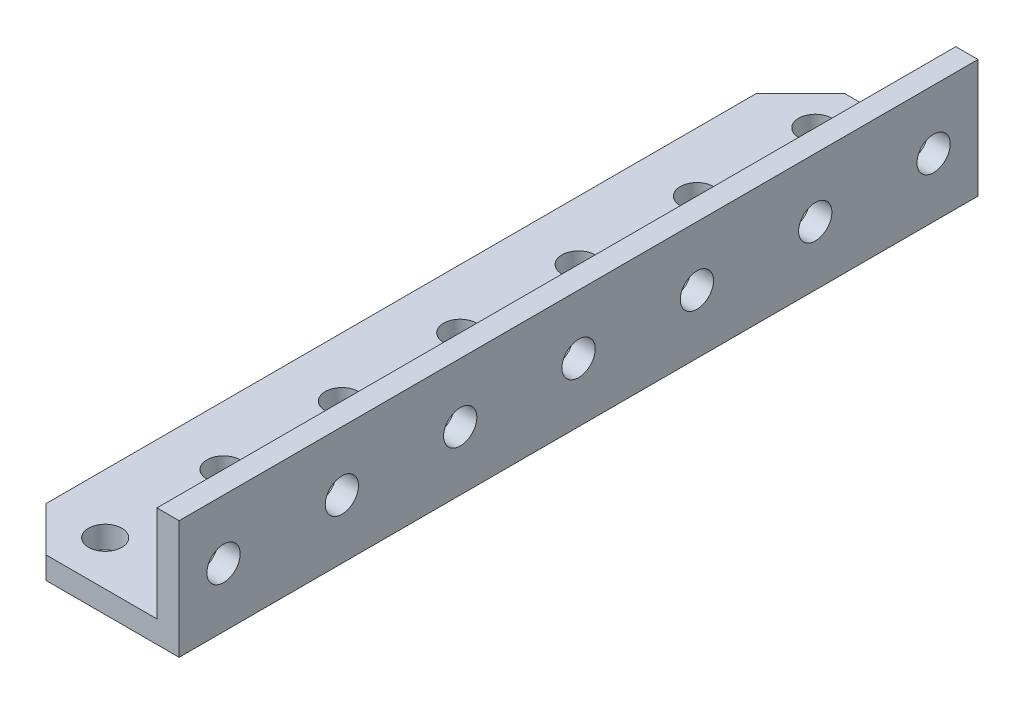
ISO-10303-21;
HEADER;
FILE_DESCRIPTION(('STEP AP214'),'2;1');
FILE_NAME('part.step','',(''),(''),'','','');
FILE_SCHEMA(('AUTOMOTIVE_DESIGN { 1 0 10303 214 1 1 1 1 }'));
ENDSEC;
DATA;
#1=APPLICATION_CONTEXT('core data for automotive mechanical design processes');
#2=APPLICATION_PROTOCOL_DEFINITION('international standard','automotive_design',2000,#1);
#3=PRODUCT_CONTEXT('',#1,'mechanical');
#4=PRODUCT('Part','Part','',(#3));
#5=PRODUCT_RELATED_PRODUCT_CATEGORY('part','',(#4));
#6=PRODUCT_DEFINITION_FORMATION('','',#4);
#7=PRODUCT_DEFINITION_CONTEXT('part definition',#1,'design');
#8=PRODUCT_DEFINITION('design','',#6,#7);
#9=PRODUCT_DEFINITION_SHAPE('','',#8);
#10=(LENGTH_UNIT() NAMED_UNIT(*) SI_UNIT(.MILLI.,.METRE.));
#11=(NAMED_UNIT(*) PLANE_ANGLE_UNIT() SI_UNIT($,.RADIAN.));
#12=(NAMED_UNIT(*) SI_UNIT($,.STERADIAN.) SOLID_ANGLE_UNIT());
#13=UNCERTAINTY_MEASURE_WITH_UNIT(LENGTH_MEASURE(1.E-05),#10,'distance_accuracy_value','');
#14=(GEOMETRIC_REPRESENTATION_CONTEXT(3) GLOBAL_UNCERTAINTY_ASSIGNED_CONTEXT((#13)) GLOBAL_UNIT_ASSIGNED_CONTEXT((#10,
#11,#12)) REPRESENTATION_CONTEXT('',''));
#15=CARTESIAN_POINT('',(0.,0.,0.));
#16=DIRECTION('',(0.,0.,1.));
#17=DIRECTION('',(1.,0.,0.));
#18=AXIS2_PLACEMENT_3D('',#15,#16,#17);
#19=CARTESIAN_POINT('',(33.3375,25.4,177.8));
#20=DIRECTION('',(1.,0.,0.));
#21=DIRECTION('',(0.,0.,-1.));
#22=AXIS2_PLACEMENT_3D('',#19,#20,#21);
#23=PLANE('',#22);
#24=CARTESIAN_POINT('',(33.3375,12.7,165.1));
#25=DIRECTION('',(-1.,0.,0.));
#26=DIRECTION('',(0.,0.,1.));
#27=AXIS2_PLACEMENT_3D('',#24,#25,#26);
#28=CIRCLE('',#27,3.57124);
#29=CARTESIAN_POINT('',(33.3375,12.7,168.67124));
#30=VERTEX_POINT('',#29);
#31=EDGE_CURVE('E236',#30,#30,#28,.T.);
#32=ORIENTED_EDGE('',*,*,#31,.F.);
#33=EDGE_LOOP('',(#32));
#34=FACE_BOUND('',#33,.T.);
#35=CARTESIAN_POINT('',(33.3375,12.7,139.7));
#36=DIRECTION('',(-1.,0.,0.));
#37=DIRECTION('',(0.,0.,1.));
#38=AXIS2_PLACEMENT_3D('',#35,#36,#37);
#39=CIRCLE('',#38,3.57124);
#40=CARTESIAN_POINT('',(33.3375,12.7,143.27124));
#41=VERTEX_POINT('',#40);
#42=EDGE_CURVE('E230',#41,#41,#39,.T.);
#43=ORIENTED_EDGE('',*,*,#42,.F.);
#44=EDGE_LOOP('',(#43));
#45=FACE_BOUND('',#44,.T.);
#46=CARTESIAN_POINT('',(33.3375,12.7,114.3));
#47=DIRECTION('',(-1.,0.,0.));
#48=DIRECTION('',(0.,0.,1.));
#49=AXIS2_PLACEMENT_3D('',#46,#47,#48);
#50=CIRCLE('',#49,3.57124);
#51=CARTESIAN_POINT('',(33.3375,12.7,117.87124));
#52=VERTEX_POINT('',#51);
#53=EDGE_CURVE('E224',#52,#52,#50,.T.);
#54=ORIENTED_EDGE('',*,*,#53,.F.);
#55=EDGE_LOOP('',(#54));
#56=FACE_BOUND('',#55,.T.);
#57=CARTESIAN_POINT('',(33.3375,12.7,88.9));
#58=DIRECTION('',(-1.,0.,0.));
#59=DIRECTION('',(0.,0.,1.));
#60=AXIS2_PLACEMENT_3D('',#57,#58,#59);
#61=CIRCLE('',#60,3.57124);
#62=CARTESIAN_POINT('',(33.3375,12.7,92.47124));
#63=VERTEX_POINT('',#62);
#64=EDGE_CURVE('E218',#63,#63,#61,.T.);
#65=ORIENTED_EDGE('',*,*,#64,.F.);
#66=EDGE_LOOP('',(#65));
#67=FACE_BOUND('',#66,.T.);
#68=CARTESIAN_POINT('',(33.3375,12.7,63.5));
#69=DIRECTION('',(-1.,0.,0.));
#70=DIRECTION('',(0.,0.,1.));
#71=AXIS2_PLACEMENT_3D('',#68,#69,#70);
#72=CIRCLE('',#71,3.57124);
#73=CARTESIAN_POINT('',(33.3375,12.7,67.07124));
#74=VERTEX_POINT('',#73);
#75=EDGE_CURVE('E212',#74,#74,#72,.T.);
#76=ORIENTED_EDGE('',*,*,#75,.F.);
#77=EDGE_LOOP('',(#76));
#78=FACE_BOUND('',#77,.T.);
#79=CARTESIAN_POINT('',(33.3375,12.7,38.1));
#80=DIRECTION('',(-1.,0.,0.));
#81=DIRECTION('',(0.,0.,1.));
#82=AXIS2_PLACEMENT_3D('',#79,#80,#81);
#83=CIRCLE('',#82,3.57124);
#84=CARTESIAN_POINT('',(33.3375,12.7,41.67124));
#85=VERTEX_POINT('',#84);
#86=EDGE_CURVE('E206',#85,#85,#83,.T.);
#87=ORIENTED_EDGE('',*,*,#86,.F.);
#88=EDGE_LOOP('',(#87));
#89=FACE_BOUND('',#88,.T.);
#90=CARTESIAN_POINT('',(33.3375,12.7,12.7));
#91=DIRECTION('',(-1.,0.,0.));
#92=DIRECTION('',(0.,0.,1.));
#93=AXIS2_PLACEMENT_3D('',#90,#91,#92);
#94=CIRCLE('',#93,3.57124);
#95=CARTESIAN_POINT('',(33.3375,12.7,16.27124));
#96=VERTEX_POINT('',#95);
#97=EDGE_CURVE('E196',#96,#96,#94,.T.);
#98=ORIENTED_EDGE('',*,*,#97,.F.);
#99=EDGE_LOOP('',(#98));
#100=FACE_BOUND('',#99,.T.);
#101=DIRECTION('',(0.,-1.,0.));
#102=VECTOR('',#101,1.);
#103=CARTESIAN_POINT('',(33.3375,25.4,174.625));
#104=LINE('',#103,#102);
#105=CARTESIAN_POINT('',(33.3375,25.4,174.625));
#106=VERTEX_POINT('',#105);
#107=CARTESIAN_POINT('',(33.3375,4.7625,174.625));
#108=VERTEX_POINT('',#107);
#109=EDGE_CURVE('E450',#106,#108,#104,.T.);
#110=ORIENTED_EDGE('',*,*,#109,.F.);
#111=DIRECTION('',(0.,0.,-1.));
#112=VECTOR('',#111,1.);
#113=CARTESIAN_POINT('',(33.3375,25.4,177.8));
#114=LINE('',#113,#112);
#115=CARTESIAN_POINT('',(33.3375,25.4,3.175));
#116=VERTEX_POINT('',#115);
#117=EDGE_CURVE('E137',#106,#116,#114,.T.);
#118=ORIENTED_EDGE('',*,*,#117,.T.);
#119=DIRECTION('',(0.,1.,0.));
#120=VECTOR('',#119,1.);
#121=CARTESIAN_POINT('',(33.3375,25.4,3.17500000000001));
#122=LINE('',#121,#120);
#123=CARTESIAN_POINT('',(33.3375,4.7625,3.17500000000001));
#124=VERTEX_POINT('',#123);
#125=EDGE_CURVE('E193',#124,#116,#122,.T.);
#126=ORIENTED_EDGE('',*,*,#125,.F.);
#127=DIRECTION('',(0.,0.,-1.));
#128=VECTOR('',#127,1.);
#129=CARTESIAN_POINT('',(33.3375,4.7625,177.8));
#130=LINE('',#129,#128);
#131=EDGE_CURVE('E155',#108,#124,#130,.T.);
#132=ORIENTED_EDGE('',*,*,#131,.F.);
#133=EDGE_LOOP('',(#110,#118,#126,#132));
#134=FACE_BOUND('',#133,.T.);
#135=ADVANCED_FACE('F56',(#34,#45,#56,#67,#78,#89,#100,#134),#23,.F.);
#136=CARTESIAN_POINT('',(33.3375,4.7625,177.8));
#137=DIRECTION('',(0.,-1.,0.));
#138=DIRECTION('',(1.,0.,0.));
#139=AXIS2_PLACEMENT_3D('',#136,#137,#138);
#140=PLANE('',#139);
#141=CARTESIAN_POINT('',(12.7,4.7625,12.7));
#142=DIRECTION('',(0.,1.,0.));
#143=DIRECTION('',(0.,0.,1.));
#144=AXIS2_PLACEMENT_3D('',#141,#142,#143);
#145=CIRCLE('',#144,3.57124);
#146=CARTESIAN_POINT('',(12.7,4.7625,16.27124));
#147=VERTEX_POINT('',#146);
#148=EDGE_CURVE('E278',#147,#147,#145,.T.);
#149=ORIENTED_EDGE('',*,*,#148,.F.);
#150=EDGE_LOOP('',(#149));
#151=FACE_BOUND('',#150,.T.);
#152=CARTESIAN_POINT('',(12.7,4.7625,38.1));
#153=DIRECTION('',(0.,1.,0.));
#154=DIRECTION('',(0.,0.,1.));
#155=AXIS2_PLACEMENT_3D('',#152,#153,#154);
#156=CIRCLE('',#155,3.57124);
#157=CARTESIAN_POINT('',(12.7,4.7625,41.67124));
#158=VERTEX_POINT('',#157);
#159=EDGE_CURVE('E272',#158,#158,#156,.T.);
#160=ORIENTED_EDGE('',*,*,#159,.F.);
#161=EDGE_LOOP('',(#160));
#162=FACE_BOUND('',#161,.T.);
#163=CARTESIAN_POINT('',(12.7,4.7625,63.5));
#164=DIRECTION('',(0.,1.,0.));
#165=DIRECTION('',(0.,0.,1.));
#166=AXIS2_PLACEMENT_3D('',#163,#164,#165);
#167=CIRCLE('',#166,3.57124);
#168=CARTESIAN_POINT('',(12.7,4.7625,67.07124));
#169=VERTEX_POINT('',#168);
#170=EDGE_CURVE('E266',#169,#169,#167,.T.);
#171=ORIENTED_EDGE('',*,*,#170,.F.);
#172=EDGE_LOOP('',(#171));
#173=FACE_BOUND('',#172,.T.);
#174=CARTESIAN_POINT('',(12.7,4.7625,88.9));
#175=DIRECTION('',(0.,1.,0.));
#176=DIRECTION('',(0.,0.,1.));
#177=AXIS2_PLACEMENT_3D('',#174,#175,#176);
#178=CIRCLE('',#177,3.57124);
#179=CARTESIAN_POINT('',(12.7,4.7625,92.47124));
#180=VERTEX_POINT('',#179);
#181=EDGE_CURVE('E260',#180,#180,#178,.T.);
#182=ORIENTED_EDGE('',*,*,#181,.F.);
#183=EDGE_LOOP('',(#182));
#184=FACE_BOUND('',#183,.T.);
#185=CARTESIAN_POINT('',(12.7,4.7625,114.3));
#186=DIRECTION('',(0.,1.,0.));
#187=DIRECTION('',(0.,0.,1.));
#188=AXIS2_PLACEMENT_3D('',#185,#186,#187);
#189=CIRCLE('',#188,3.57124);
#190=CARTESIAN_POINT('',(12.7,4.7625,117.87124));
#191=VERTEX_POINT('',#190);
#192=EDGE_CURVE('E254',#191,#191,#189,.T.);
#193=ORIENTED_EDGE('',*,*,#192,.F.);
#194=EDGE_LOOP('',(#193));
#195=FACE_BOUND('',#194,.T.);
#196=CARTESIAN_POINT('',(12.7,4.7625,139.7));
#197=DIRECTION('',(0.,1.,0.));
#198=DIRECTION('',(0.,0.,1.));
#199=AXIS2_PLACEMENT_3D('',#196,#197,#198);
#200=CIRCLE('',#199,3.57124);
#201=CARTESIAN_POINT('',(12.7,4.7625,143.27124));
#202=VERTEX_POINT('',#201);
#203=EDGE_CURVE('E248',#202,#202,#200,.T.);
#204=ORIENTED_EDGE('',*,*,#203,.F.);
#205=EDGE_LOOP('',(#204));
#206=FACE_BOUND('',#205,.T.);
#207=CARTESIAN_POINT('',(12.7,4.7625,165.1));
#208=DIRECTION('',(0.,1.,0.));
#209=DIRECTION('',(0.,0.,1.));
#210=AXIS2_PLACEMENT_3D('',#207,#208,#209);
#211=CIRCLE('',#210,3.57124);
#212=CARTESIAN_POINT('',(12.7,4.7625,168.67124));
#213=VERTEX_POINT('',#212);
#214=EDGE_CURVE('E242',#213,#213,#211,.T.);
#215=ORIENTED_EDGE('',*,*,#214,.F.);
#216=EDGE_LOOP('',(#215));
#217=FACE_BOUND('',#216,.T.);
#218=DIRECTION('',(-1.,0.,0.));
#219=VECTOR('',#218,1.);
#220=CARTESIAN_POINT('',(33.3375,4.7625,174.625));
#221=LINE('',#220,#219);
#222=CARTESIAN_POINT('',(9.52500000000002,4.7625,174.625));
#223=VERTEX_POINT('',#222);
#224=EDGE_CURVE('E72',#108,#223,#221,.T.);
#225=ORIENTED_EDGE('',*,*,#224,.F.);
#226=ORIENTED_EDGE('',*,*,#131,.T.);
#227=DIRECTION('',(1.,0.,0.));
#228=VECTOR('',#227,1.);
#229=CARTESIAN_POINT('',(33.3375,4.7625,3.17500000000001));
#230=LINE('',#229,#228);
#231=CARTESIAN_POINT('',(9.52500000000006,4.7625,3.175));
#232=VERTEX_POINT('',#231);
#233=EDGE_CURVE('E190',#232,#124,#230,.T.);
#234=ORIENTED_EDGE('',*,*,#233,.F.);
#235=DIRECTION('',(-0.707106781186549,0.,0.707106781186546));
#236=VECTOR('',#235,1.);
#237=CARTESIAN_POINT('',(0.,4.7625,12.7));
#238=LINE('',#237,#236);
#239=CARTESIAN_POINT('',(0.,4.7625,12.7));
#240=VERTEX_POINT('',#239);
#241=EDGE_CURVE('E167',#232,#240,#238,.T.);
#242=ORIENTED_EDGE('',*,*,#241,.T.);
#243=DIRECTION('',(0.,0.,-1.));
#244=VECTOR('',#243,1.);
#245=CARTESIAN_POINT('',(0.,4.7625,177.8));
#246=LINE('',#245,#244);
#247=CARTESIAN_POINT('',(0.,4.7625,165.1));
#248=VERTEX_POINT('',#247);
#249=EDGE_CURVE('E152',#248,#240,#246,.T.);
#250=ORIENTED_EDGE('',*,*,#249,.F.);
#251=DIRECTION('',(-0.707106781186546,0.,-0.707106781186549));
#252=VECTOR('',#251,1.);
#253=CARTESIAN_POINT('',(12.7,4.7625,177.8));
#254=LINE('',#253,#252);
#255=EDGE_CURVE('E169',#248,#223,#254,.F.);
#256=ORIENTED_EDGE('',*,*,#255,.T.);
#257=EDGE_LOOP('',(#225,#226,#234,#242,#250,#256));
#258=FACE_BOUND('',#257,.T.);
#259=ADVANCED_FACE('F188',(#151,#162,#173,#184,#195,#206,#217,#258),#140,.F.);
#260=CARTESIAN_POINT('',(0.,0.,177.8));
#261=DIRECTION('',(0.,1.,0.));
#262=DIRECTION('',(0.,0.,1.));
#263=AXIS2_PLACEMENT_3D('',#260,#261,#262);
#264=PLANE('',#263);
#265=CARTESIAN_POINT('',(12.7,0.,165.1));
#266=DIRECTION('',(0.,1.,0.));
#267=DIRECTION('',(0.,0.,1.));
#268=AXIS2_PLACEMENT_3D('',#265,#266,#267);
#269=CIRCLE('',#268,3.57124);
#270=CARTESIAN_POINT('',(12.7,0.,168.67124));
#271=VERTEX_POINT('',#270);
#272=EDGE_CURVE('E245',#271,#271,#269,.T.);
#273=ORIENTED_EDGE('',*,*,#272,.T.);
#274=EDGE_LOOP('',(#273));
#275=FACE_BOUND('',#274,.T.);
#276=CARTESIAN_POINT('',(12.7,0.,139.7));
#277=DIRECTION('',(0.,1.,0.));
#278=DIRECTION('',(0.,0.,1.));
#279=AXIS2_PLACEMENT_3D('',#276,#277,#278);
#280=CIRCLE('',#279,3.57124);
#281=CARTESIAN_POINT('',(12.7,0.,143.27124));
#282=VERTEX_POINT('',#281);
#283=EDGE_CURVE('E251',#282,#282,#280,.T.);
#284=ORIENTED_EDGE('',*,*,#283,.T.);
#285=EDGE_LOOP('',(#284));
#286=FACE_BOUND('',#285,.T.);
#287=CARTESIAN_POINT('',(12.7,0.,114.3));
#288=DIRECTION('',(0.,1.,0.));
#289=DIRECTION('',(0.,0.,1.));
#290=AXIS2_PLACEMENT_3D('',#287,#288,#289);
#291=CIRCLE('',#290,3.57124);
#292=CARTESIAN_POINT('',(12.7,0.,117.87124));
#293=VERTEX_POINT('',#292);
#294=EDGE_CURVE('E257',#293,#293,#291,.T.);
#295=ORIENTED_EDGE('',*,*,#294,.T.);
#296=EDGE_LOOP('',(#295));
#297=FACE_BOUND('',#296,.T.);
#298=CARTESIAN_POINT('',(12.7,0.,88.9));
#299=DIRECTION('',(0.,1.,0.));
#300=DIRECTION('',(0.,0.,1.));
#301=AXIS2_PLACEMENT_3D('',#298,#299,#300);
#302=CIRCLE('',#301,3.57124);
#303=CARTESIAN_POINT('',(12.7,0.,92.47124));
#304=VERTEX_POINT('',#303);
#305=EDGE_CURVE('E263',#304,#304,#302,.T.);
#306=ORIENTED_EDGE('',*,*,#305,.T.);
#307=EDGE_LOOP('',(#306));
#308=FACE_BOUND('',#307,.T.);
#309=CARTESIAN_POINT('',(12.7,0.,63.5));
#310=DIRECTION('',(0.,1.,0.));
#311=DIRECTION('',(0.,0.,1.));
#312=AXIS2_PLACEMENT_3D('',#309,#310,#311);
#313=CIRCLE('',#312,3.57124);
#314=CARTESIAN_POINT('',(12.7,0.,67.07124));
#315=VERTEX_POINT('',#314);
#316=EDGE_CURVE('E269',#315,#315,#313,.T.);
#317=ORIENTED_EDGE('',*,*,#316,.T.);
#318=EDGE_LOOP('',(#317));
#319=FACE_BOUND('',#318,.T.);
#320=CARTESIAN_POINT('',(12.7,0.,38.1));
#321=DIRECTION('',(0.,1.,0.));
#322=DIRECTION('',(0.,0.,1.));
#323=AXIS2_PLACEMENT_3D('',#320,#321,#322);
#324=CIRCLE('',#323,3.57124);
#325=CARTESIAN_POINT('',(12.7,0.,41.67124));
#326=VERTEX_POINT('',#325);
#327=EDGE_CURVE('E275',#326,#326,#324,.T.);
#328=ORIENTED_EDGE('',*,*,#327,.T.);
#329=EDGE_LOOP('',(#328));
#330=FACE_BOUND('',#329,.T.);
#331=CARTESIAN_POINT('',(12.7,0.,12.7));
#332=DIRECTION('',(0.,1.,0.));
#333=DIRECTION('',(0.,0.,1.));
#334=AXIS2_PLACEMENT_3D('',#331,#332,#333);
#335=CIRCLE('',#334,3.57124);
#336=CARTESIAN_POINT('',(12.7,0.,16.27124));
#337=VERTEX_POINT('',#336);
#338=EDGE_CURVE('E146',#337,#337,#335,.T.);
#339=ORIENTED_EDGE('',*,*,#338,.T.);
#340=EDGE_LOOP('',(#339));
#341=FACE_BOUND('',#340,.T.);
#342=DIRECTION('',(-1.,0.,0.));
#343=VECTOR('',#342,1.);
#344=CARTESIAN_POINT('',(38.1,0.,174.625));
#345=LINE('',#344,#343);
#346=CARTESIAN_POINT('',(38.1,0.,174.625));
#347=VERTEX_POINT('',#346);
#348=CARTESIAN_POINT('',(9.52500000000003,0.,174.625));
#349=VERTEX_POINT('',#348);
#350=EDGE_CURVE('E126',#347,#349,#345,.T.);
#351=ORIENTED_EDGE('',*,*,#350,.T.);
#352=DIRECTION('',(0.707106781186546,0.,0.707106781186549));
#353=VECTOR('',#352,1.);
#354=CARTESIAN_POINT('',(12.7,0.,177.8));
#355=LINE('',#354,#353);
#356=CARTESIAN_POINT('',(0.,0.,165.1));
#357=VERTEX_POINT('',#356);
#358=EDGE_CURVE('E160',#349,#357,#355,.F.);
#359=ORIENTED_EDGE('',*,*,#358,.T.);
#360=DIRECTION('',(0.,0.,-1.));
#361=VECTOR('',#360,1.);
#362=CARTESIAN_POINT('',(0.,0.,177.8));
#363=LINE('',#362,#361);
#364=CARTESIAN_POINT('',(0.,0.,12.7));
#365=VERTEX_POINT('',#364);
#366=EDGE_CURVE('E144',#357,#365,#363,.T.);
#367=ORIENTED_EDGE('',*,*,#366,.T.);
#368=DIRECTION('',(0.707106781186549,0.,-0.707106781186546));
#369=VECTOR('',#368,1.);
#370=CARTESIAN_POINT('',(0.,0.,12.7));
#371=LINE('',#370,#369);
#372=CARTESIAN_POINT('',(9.52500000000006,0.,3.175));
#373=VERTEX_POINT('',#372);
#374=EDGE_CURVE('E157',#365,#373,#371,.T.);
#375=ORIENTED_EDGE('',*,*,#374,.T.);
#376=DIRECTION('',(-1.,0.,0.));
#377=VECTOR('',#376,1.);
#378=CARTESIAN_POINT('',(38.1,0.,3.175));
#379=LINE('',#378,#377);
#380=CARTESIAN_POINT('',(38.1,0.,3.175));
#381=VERTEX_POINT('',#380);
#382=EDGE_CURVE('E79',#381,#373,#379,.T.);
#383=ORIENTED_EDGE('',*,*,#382,.F.);
#384=DIRECTION('',(0.,0.,-1.));
#385=VECTOR('',#384,1.);
#386=CARTESIAN_POINT('',(38.1,0.,177.8));
#387=LINE('',#386,#385);
#388=EDGE_CURVE('E142',#347,#381,#387,.T.);
#389=ORIENTED_EDGE('',*,*,#388,.F.);
#390=EDGE_LOOP('',(#351,#359,#367,#375,#383,#389));
#391=FACE_BOUND('',#390,.T.);
#392=ADVANCED_FACE('F177',(#275,#286,#297,#308,#319,#330,#341,#391),#264,.F.);
#393=CARTESIAN_POINT('',(38.1,0.,177.8));
#394=DIRECTION('',(-1.,0.,0.));
#395=DIRECTION('',(0.,0.,1.));
#396=AXIS2_PLACEMENT_3D('',#393,#394,#395);
#397=PLANE('',#396);
#398=CARTESIAN_POINT('',(38.1,12.7,12.7));
#399=DIRECTION('',(-1.,0.,0.));
#400=DIRECTION('',(0.,0.,1.));
#401=AXIS2_PLACEMENT_3D('',#398,#399,#400);
#402=CIRCLE('',#401,3.57124);
#403=CARTESIAN_POINT('',(38.1,12.7,16.27124));
#404=VERTEX_POINT('',#403);
#405=EDGE_CURVE('E203',#404,#404,#402,.T.);
#406=ORIENTED_EDGE('',*,*,#405,.T.);
#407=EDGE_LOOP('',(#406));
#408=FACE_BOUND('',#407,.T.);
#409=CARTESIAN_POINT('',(38.1,12.7,38.1));
#410=DIRECTION('',(-1.,0.,0.));
#411=DIRECTION('',(0.,0.,1.));
#412=AXIS2_PLACEMENT_3D('',#409,#410,#411);
#413=CIRCLE('',#412,3.57124);
#414=CARTESIAN_POINT('',(38.1,12.7,41.67124));
#415=VERTEX_POINT('',#414);
#416=EDGE_CURVE('E209',#415,#415,#413,.T.);
#417=ORIENTED_EDGE('',*,*,#416,.T.);
#418=EDGE_LOOP('',(#417));
#419=FACE_BOUND('',#418,.T.);
#420=CARTESIAN_POINT('',(38.1,12.7,63.5));
#421=DIRECTION('',(-1.,0.,0.));
#422=DIRECTION('',(0.,0.,1.));
#423=AXIS2_PLACEMENT_3D('',#420,#421,#422);
#424=CIRCLE('',#423,3.57124);
#425=CARTESIAN_POINT('',(38.1,12.7,67.07124));
#426=VERTEX_POINT('',#425);
#427=EDGE_CURVE('E215',#426,#426,#424,.T.);
#428=ORIENTED_EDGE('',*,*,#427,.T.);
#429=EDGE_LOOP('',(#428));
#430=FACE_BOUND('',#429,.T.);
#431=CARTESIAN_POINT('',(38.1,12.7,88.9));
#432=DIRECTION('',(-1.,0.,0.));
#433=DIRECTION('',(0.,0.,1.));
#434=AXIS2_PLACEMENT_3D('',#431,#432,#433);
#435=CIRCLE('',#434,3.57124);
#436=CARTESIAN_POINT('',(38.1,12.7,92.47124));
#437=VERTEX_POINT('',#436);
#438=EDGE_CURVE('E221',#437,#437,#435,.T.);
#439=ORIENTED_EDGE('',*,*,#438,.T.);
#440=EDGE_LOOP('',(#439));
#441=FACE_BOUND('',#440,.T.);
#442=CARTESIAN_POINT('',(38.1,12.7,114.3));
#443=DIRECTION('',(-1.,0.,0.));
#444=DIRECTION('',(0.,0.,1.));
#445=AXIS2_PLACEMENT_3D('',#442,#443,#444);
#446=CIRCLE('',#445,3.57124);
#447=CARTESIAN_POINT('',(38.1,12.7,117.87124));
#448=VERTEX_POINT('',#447);
#449=EDGE_CURVE('E227',#448,#448,#446,.T.);
#450=ORIENTED_EDGE('',*,*,#449,.T.);
#451=EDGE_LOOP('',(#450));
#452=FACE_BOUND('',#451,.T.);
#453=CARTESIAN_POINT('',(38.1,12.7,139.7));
#454=DIRECTION('',(-1.,0.,0.));
#455=DIRECTION('',(0.,0.,1.));
#456=AXIS2_PLACEMENT_3D('',#453,#454,#455);
#457=CIRCLE('',#456,3.57124);
#458=CARTESIAN_POINT('',(38.1,12.7,143.27124));
#459=VERTEX_POINT('',#458);
#460=EDGE_CURVE('E233',#459,#459,#457,.T.);
#461=ORIENTED_EDGE('',*,*,#460,.T.);
#462=EDGE_LOOP('',(#461));
#463=FACE_BOUND('',#462,.T.);
#464=CARTESIAN_POINT('',(38.1,12.7,165.1));
#465=DIRECTION('',(-1.,0.,0.));
#466=DIRECTION('',(0.,0.,1.));
#467=AXIS2_PLACEMENT_3D('',#464,#465,#466);
#468=CIRCLE('',#467,3.57124);
#469=CARTESIAN_POINT('',(38.1,12.7,168.67124));
#470=VERTEX_POINT('',#469);
#471=EDGE_CURVE('E239',#470,#470,#468,.T.);
#472=ORIENTED_EDGE('',*,*,#471,.T.);
#473=EDGE_LOOP('',(#472));
#474=FACE_BOUND('',#473,.T.);
#475=DIRECTION('',(0.,-1.,0.));
#476=VECTOR('',#475,1.);
#477=CARTESIAN_POINT('',(38.1,25.4,174.625));
#478=LINE('',#477,#476);
#479=CARTESIAN_POINT('',(38.1,25.4,174.625));
#480=VERTEX_POINT('',#479);
#481=EDGE_CURVE('E120',#480,#347,#478,.T.);
#482=ORIENTED_EDGE('',*,*,#481,.T.);
#483=ORIENTED_EDGE('',*,*,#388,.T.);
#484=DIRECTION('',(0.,-1.,0.));
#485=VECTOR('',#484,1.);
#486=CARTESIAN_POINT('',(38.1,25.4,3.175));
#487=LINE('',#486,#485);
#488=CARTESIAN_POINT('',(38.1,25.4,3.175));
#489=VERTEX_POINT('',#488);
#490=EDGE_CURVE('E141',#489,#381,#487,.T.);
#491=ORIENTED_EDGE('',*,*,#490,.F.);
#492=DIRECTION('',(0.,0.,-1.));
#493=VECTOR('',#492,1.);
#494=CARTESIAN_POINT('',(38.1,25.4,177.8));
#495=LINE('',#494,#493);
#496=EDGE_CURVE('E135',#480,#489,#495,.T.);
#497=ORIENTED_EDGE('',*,*,#496,.F.);
#498=EDGE_LOOP('',(#482,#483,#491,#497));
#499=FACE_BOUND('',#498,.T.);
#500=ADVANCED_FACE('F140',(#408,#419,#430,#441,#452,#463,#474,#499),#397,.F.);
#501=CARTESIAN_POINT('',(38.1,25.4,177.8));
#502=DIRECTION('',(0.,-1.,0.));
#503=DIRECTION('',(1.,0.,0.));
#504=AXIS2_PLACEMENT_3D('',#501,#502,#503);
#505=PLANE('',#504);
#506=DIRECTION('',(1.,0.,0.));
#507=VECTOR('',#506,1.);
#508=CARTESIAN_POINT('',(38.1,25.4,174.625));
#509=LINE('',#508,#507);
#510=EDGE_CURVE('E123',#106,#480,#509,.T.);
#511=ORIENTED_EDGE('',*,*,#510,.T.);
#512=ORIENTED_EDGE('',*,*,#496,.T.);
#513=DIRECTION('',(1.,0.,0.));
#514=VECTOR('',#513,1.);
#515=CARTESIAN_POINT('',(38.1,25.4,3.175));
#516=LINE('',#515,#514);
#517=EDGE_CURVE('E194',#116,#489,#516,.T.);
#518=ORIENTED_EDGE('',*,*,#517,.F.);
#519=ORIENTED_EDGE('',*,*,#117,.F.);
#520=EDGE_LOOP('',(#511,#512,#518,#519));
#521=FACE_BOUND('',#520,.T.);
#522=ADVANCED_FACE('F133',(#521),#505,.F.);
#523=CARTESIAN_POINT('',(12.7,0.,177.8));
#524=DIRECTION('',(0.707106781186549,0.,-0.707106781186546));
#525=DIRECTION('',(0.,-1.,0.));
#526=AXIS2_PLACEMENT_3D('',#523,#524,#525);
#527=PLANE('',#526);
#528=ORIENTED_EDGE('',*,*,#358,.F.);
#529=DIRECTION('',(0.,-1.,0.));
#530=VECTOR('',#529,1.);
#531=CARTESIAN_POINT('',(9.52500000000002,0.,174.625));
#532=LINE('',#531,#530);
#533=EDGE_CURVE('E13',#349,#223,#532,.F.);
#534=ORIENTED_EDGE('',*,*,#533,.T.);
#535=ORIENTED_EDGE('',*,*,#255,.F.);
#536=DIRECTION('',(0.,1.,0.));
#537=VECTOR('',#536,1.);
#538=CARTESIAN_POINT('',(0.,4.7625,165.1));
#539=LINE('',#538,#537);
#540=EDGE_CURVE('E165',#357,#248,#539,.T.);
#541=ORIENTED_EDGE('',*,*,#540,.F.);
#542=EDGE_LOOP('',(#528,#534,#535,#541));
#543=FACE_BOUND('',#542,.T.);
#544=ADVANCED_FACE('F186',(#543),#527,.F.);
#545=CARTESIAN_POINT('',(0.,4.7625,12.7));
#546=DIRECTION('',(-0.707106781186546,0.,-0.707106781186549));
#547=DIRECTION('',(0.,1.,0.));
#548=AXIS2_PLACEMENT_3D('',#545,#546,#547);
#549=PLANE('',#548);
#550=ORIENTED_EDGE('',*,*,#241,.F.);
#551=DIRECTION('',(0.,-1.,0.));
#552=VECTOR('',#551,1.);
#553=CARTESIAN_POINT('',(9.52500000000006,4.7625,3.175));
#554=LINE('',#553,#552);
#555=EDGE_CURVE('E65',#232,#373,#554,.T.);
#556=ORIENTED_EDGE('',*,*,#555,.T.);
#557=ORIENTED_EDGE('',*,*,#374,.F.);
#558=DIRECTION('',(0.,-1.,0.));
#559=VECTOR('',#558,1.);
#560=CARTESIAN_POINT('',(0.,0.,12.7));
#561=LINE('',#560,#559);
#562=EDGE_CURVE('E162',#240,#365,#561,.T.);
#563=ORIENTED_EDGE('',*,*,#562,.F.);
#564=EDGE_LOOP('',(#550,#556,#557,#563));
#565=FACE_BOUND('',#564,.T.);
#566=ADVANCED_FACE('F59',(#565),#549,.T.);
#567=CARTESIAN_POINT('',(0.,4.7625,177.8));
#568=DIRECTION('',(1.,0.,0.));
#569=DIRECTION('',(0.,1.,0.));
#570=AXIS2_PLACEMENT_3D('',#567,#568,#569);
#571=PLANE('',#570);
#572=ORIENTED_EDGE('',*,*,#366,.F.);
#573=ORIENTED_EDGE('',*,*,#540,.T.);
#574=ORIENTED_EDGE('',*,*,#249,.T.);
#575=ORIENTED_EDGE('',*,*,#562,.T.);
#576=EDGE_LOOP('',(#572,#573,#574,#575));
#577=FACE_BOUND('',#576,.T.);
#578=ADVANCED_FACE('F182',(#577),#571,.F.);
#579=CARTESIAN_POINT('',(12.7,4.7625,12.7));
#580=DIRECTION('',(0.,1.,0.));
#581=DIRECTION('',(0.,0.,1.));
#582=AXIS2_PLACEMENT_3D('',#579,#580,#581);
#583=CYLINDRICAL_SURFACE('',#582,3.57124);
#584=ORIENTED_EDGE('',*,*,#338,.F.);
#585=EDGE_LOOP('',(#584));
#586=FACE_BOUND('',#585,.T.);
#587=ORIENTED_EDGE('',*,*,#148,.T.);
#588=EDGE_LOOP('',(#587));
#589=FACE_BOUND('',#588,.T.);
#590=ADVANCED_FACE('F284',(#586,#589),#583,.F.);
#591=CARTESIAN_POINT('',(12.7,4.7625,38.1));
#592=DIRECTION('',(0.,1.,0.));
#593=DIRECTION('',(0.,0.,1.));
#594=AXIS2_PLACEMENT_3D('',#591,#592,#593);
#595=CYLINDRICAL_SURFACE('',#594,3.57124);
#596=ORIENTED_EDGE('',*,*,#327,.F.);
#597=EDGE_LOOP('',(#596));
#598=FACE_BOUND('',#597,.T.);
#599=ORIENTED_EDGE('',*,*,#159,.T.);
#600=EDGE_LOOP('',(#599));
#601=FACE_BOUND('',#600,.T.);
#602=ADVANCED_FACE('F287',(#598,#601),#595,.F.);
#603=CARTESIAN_POINT('',(12.7,4.7625,63.5));
#604=DIRECTION('',(0.,1.,0.));
#605=DIRECTION('',(0.,0.,1.));
#606=AXIS2_PLACEMENT_3D('',#603,#604,#605);
#607=CYLINDRICAL_SURFACE('',#606,3.57124);
#608=ORIENTED_EDGE('',*,*,#316,.F.);
#609=EDGE_LOOP('',(#608));
#610=FACE_BOUND('',#609,.T.);
#611=ORIENTED_EDGE('',*,*,#170,.T.);
#612=EDGE_LOOP('',(#611));
#613=FACE_BOUND('',#612,.T.);
#614=ADVANCED_FACE('F524',(#610,#613),#607,.F.);
#615=CARTESIAN_POINT('',(12.7,4.7625,88.9));
#616=DIRECTION('',(0.,1.,0.));
#617=DIRECTION('',(0.,0.,1.));
#618=AXIS2_PLACEMENT_3D('',#615,#616,#617);
#619=CYLINDRICAL_SURFACE('',#618,3.57124);
#620=ORIENTED_EDGE('',*,*,#305,.F.);
#621=EDGE_LOOP('',(#620));
#622=FACE_BOUND('',#621,.T.);
#623=ORIENTED_EDGE('',*,*,#181,.T.);
#624=EDGE_LOOP('',(#623));
#625=FACE_BOUND('',#624,.T.);
#626=ADVANCED_FACE('F515',(#622,#625),#619,.F.);
#627=CARTESIAN_POINT('',(12.7,4.7625,114.3));
#628=DIRECTION('',(0.,1.,0.));
#629=DIRECTION('',(0.,0.,1.));
#630=AXIS2_PLACEMENT_3D('',#627,#628,#629);
#631=CYLINDRICAL_SURFACE('',#630,3.57124);
#632=ORIENTED_EDGE('',*,*,#294,.F.);
#633=EDGE_LOOP('',(#632));
#634=FACE_BOUND('',#633,.T.);
#635=ORIENTED_EDGE('',*,*,#192,.T.);
#636=EDGE_LOOP('',(#635));
#637=FACE_BOUND('',#636,.T.);
#638=ADVANCED_FACE('F319',(#634,#637),#631,.F.);
#639=CARTESIAN_POINT('',(12.7,4.7625,139.7));
#640=DIRECTION('',(0.,1.,0.));
#641=DIRECTION('',(0.,0.,1.));
#642=AXIS2_PLACEMENT_3D('',#639,#640,#641);
#643=CYLINDRICAL_SURFACE('',#642,3.57124);
#644=ORIENTED_EDGE('',*,*,#283,.F.);
#645=EDGE_LOOP('',(#644));
#646=FACE_BOUND('',#645,.T.);
#647=ORIENTED_EDGE('',*,*,#203,.T.);
#648=EDGE_LOOP('',(#647));
#649=FACE_BOUND('',#648,.T.);
#650=ADVANCED_FACE('F309',(#646,#649),#643,.F.);
#651=CARTESIAN_POINT('',(12.7,4.7625,165.1));
#652=DIRECTION('',(0.,1.,0.));
#653=DIRECTION('',(0.,0.,1.));
#654=AXIS2_PLACEMENT_3D('',#651,#652,#653);
#655=CYLINDRICAL_SURFACE('',#654,3.57124);
#656=ORIENTED_EDGE('',*,*,#272,.F.);
#657=EDGE_LOOP('',(#656));
#658=FACE_BOUND('',#657,.T.);
#659=ORIENTED_EDGE('',*,*,#214,.T.);
#660=EDGE_LOOP('',(#659));
#661=FACE_BOUND('',#660,.T.);
#662=ADVANCED_FACE('F306',(#658,#661),#655,.F.);
#663=CARTESIAN_POINT('',(33.3375,12.7,165.1));
#664=DIRECTION('',(-1.,0.,0.));
#665=DIRECTION('',(0.,0.,1.));
#666=AXIS2_PLACEMENT_3D('',#663,#664,#665);
#667=CYLINDRICAL_SURFACE('',#666,3.57124);
#668=ORIENTED_EDGE('',*,*,#471,.F.);
#669=EDGE_LOOP('',(#668));
#670=FACE_BOUND('',#669,.T.);
#671=ORIENTED_EDGE('',*,*,#31,.T.);
#672=EDGE_LOOP('',(#671));
#673=FACE_BOUND('',#672,.T.);
#674=ADVANCED_FACE('F308',(#670,#673),#667,.F.);
#675=CARTESIAN_POINT('',(33.3375,12.7,139.7));
#676=DIRECTION('',(-1.,0.,0.));
#677=DIRECTION('',(0.,0.,1.));
#678=AXIS2_PLACEMENT_3D('',#675,#676,#677);
#679=CYLINDRICAL_SURFACE('',#678,3.57124);
#680=ORIENTED_EDGE('',*,*,#460,.F.);
#681=EDGE_LOOP('',(#680));
#682=FACE_BOUND('',#681,.T.);
#683=ORIENTED_EDGE('',*,*,#42,.T.);
#684=EDGE_LOOP('',(#683));
#685=FACE_BOUND('',#684,.T.);
#686=ADVANCED_FACE('F316',(#682,#685),#679,.F.);
#687=CARTESIAN_POINT('',(33.3375,12.7,114.3));
#688=DIRECTION('',(-1.,0.,0.));
#689=DIRECTION('',(0.,0.,1.));
#690=AXIS2_PLACEMENT_3D('',#687,#688,#689);
#691=CYLINDRICAL_SURFACE('',#690,3.57124);
#692=ORIENTED_EDGE('',*,*,#449,.F.);
#693=EDGE_LOOP('',(#692));
#694=FACE_BOUND('',#693,.T.);
#695=ORIENTED_EDGE('',*,*,#53,.T.);
#696=EDGE_LOOP('',(#695));
#697=FACE_BOUND('',#696,.T.);
#698=ADVANCED_FACE('F427',(#694,#697),#691,.F.);
#699=CARTESIAN_POINT('',(33.3375,12.7,88.9));
#700=DIRECTION('',(-1.,0.,0.));
#701=DIRECTION('',(0.,0.,1.));
#702=AXIS2_PLACEMENT_3D('',#699,#700,#701);
#703=CYLINDRICAL_SURFACE('',#702,3.57124);
#704=ORIENTED_EDGE('',*,*,#438,.F.);
#705=EDGE_LOOP('',(#704));
#706=FACE_BOUND('',#705,.T.);
#707=ORIENTED_EDGE('',*,*,#64,.T.);
#708=EDGE_LOOP('',(#707));
#709=FACE_BOUND('',#708,.T.);
#710=ADVANCED_FACE('F423',(#706,#709),#703,.F.);
#711=CARTESIAN_POINT('',(33.3375,12.7,63.5));
#712=DIRECTION('',(-1.,0.,0.));
#713=DIRECTION('',(0.,0.,1.));
#714=AXIS2_PLACEMENT_3D('',#711,#712,#713);
#715=CYLINDRICAL_SURFACE('',#714,3.57124);
#716=ORIENTED_EDGE('',*,*,#427,.F.);
#717=EDGE_LOOP('',(#716));
#718=FACE_BOUND('',#717,.T.);
#719=ORIENTED_EDGE('',*,*,#75,.T.);
#720=EDGE_LOOP('',(#719));
#721=FACE_BOUND('',#720,.T.);
#722=ADVANCED_FACE('F419',(#718,#721),#715,.F.);
#723=CARTESIAN_POINT('',(33.3375,12.7,38.1));
#724=DIRECTION('',(-1.,0.,0.));
#725=DIRECTION('',(0.,0.,1.));
#726=AXIS2_PLACEMENT_3D('',#723,#724,#725);
#727=CYLINDRICAL_SURFACE('',#726,3.57124);
#728=ORIENTED_EDGE('',*,*,#416,.F.);
#729=EDGE_LOOP('',(#728));
#730=FACE_BOUND('',#729,.T.);
#731=ORIENTED_EDGE('',*,*,#86,.T.);
#732=EDGE_LOOP('',(#731));
#733=FACE_BOUND('',#732,.T.);
#734=ADVANCED_FACE('F416',(#730,#733),#727,.F.);
#735=CARTESIAN_POINT('',(33.3375,12.7,12.7));
#736=DIRECTION('',(-1.,0.,0.));
#737=DIRECTION('',(0.,0.,1.));
#738=AXIS2_PLACEMENT_3D('',#735,#736,#737);
#739=CYLINDRICAL_SURFACE('',#738,3.57124);
#740=ORIENTED_EDGE('',*,*,#405,.F.);
#741=EDGE_LOOP('',(#740));
#742=FACE_BOUND('',#741,.T.);
#743=ORIENTED_EDGE('',*,*,#97,.T.);
#744=EDGE_LOOP('',(#743));
#745=FACE_BOUND('',#744,.T.);
#746=ADVANCED_FACE('F359',(#742,#745),#739,.F.);
#747=CARTESIAN_POINT('',(0.,0.,3.175));
#748=DIRECTION('',(0.,0.,-1.));
#749=DIRECTION('',(-1.,0.,0.));
#750=AXIS2_PLACEMENT_3D('',#747,#748,#749);
#751=PLANE('',#750);
#752=ORIENTED_EDGE('',*,*,#125,.T.);
#753=ORIENTED_EDGE('',*,*,#517,.T.);
#754=ORIENTED_EDGE('',*,*,#490,.T.);
#755=ORIENTED_EDGE('',*,*,#382,.T.);
#756=ORIENTED_EDGE('',*,*,#555,.F.);
#757=ORIENTED_EDGE('',*,*,#233,.T.);
#758=EDGE_LOOP('',(#752,#753,#754,#755,#756,#757));
#759=FACE_BOUND('',#758,.T.);
#760=ADVANCED_FACE('F369',(#759),#751,.T.);
#761=CARTESIAN_POINT('',(0.,0.,174.625));
#762=DIRECTION('',(0.,0.,1.));
#763=DIRECTION('',(-1.,0.,0.));
#764=AXIS2_PLACEMENT_3D('',#761,#762,#763);
#765=PLANE('',#764);
#766=ORIENTED_EDGE('',*,*,#109,.T.);
#767=ORIENTED_EDGE('',*,*,#224,.T.);
#768=ORIENTED_EDGE('',*,*,#533,.F.);
#769=ORIENTED_EDGE('',*,*,#350,.F.);
#770=ORIENTED_EDGE('',*,*,#481,.F.);
#771=ORIENTED_EDGE('',*,*,#510,.F.);
#772=EDGE_LOOP('',(#766,#767,#768,#769,#770,#771));
#773=FACE_BOUND('',#772,.T.);
#774=ADVANCED_FACE('F122',(#773),#765,.T.);
#775=CLOSED_SHELL('',(#135,#259,#392,#500,#522,#544,#566,#578,#590,#602,#614,#626,#638,#650,
#662,#674,#686,#698,#710,#722,#734,#746,#760,#774));
#776=MANIFOLD_SOLID_BREP('B2',#775);
#777=ADVANCED_BREP_SHAPE_REPRESENTATION('',(#18,#776),#14);
#778=SHAPE_DEFINITION_REPRESENTATION(#9,#777);
ENDSEC;
END-ISO-10303-21;
